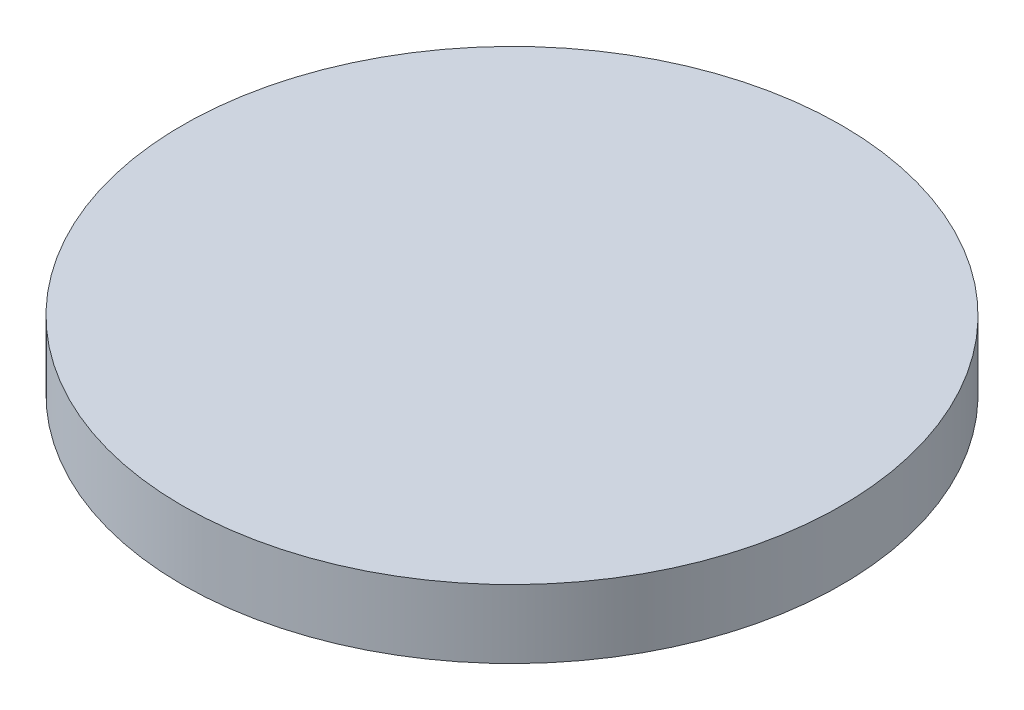
ISO-10303-21;
HEADER;
FILE_DESCRIPTION(('STEP AP214'),'2;1');
FILE_NAME('part.step','',(''),(''),'','','');
FILE_SCHEMA(('AUTOMOTIVE_DESIGN { 1 0 10303 214 1 1 1 1 }'));
ENDSEC;
DATA;
#1=APPLICATION_CONTEXT('core data for automotive mechanical design processes');
#2=APPLICATION_PROTOCOL_DEFINITION('international standard','automotive_design',2000,#1);
#3=PRODUCT_CONTEXT('',#1,'mechanical');
#4=PRODUCT('Part','Part','',(#3));
#5=PRODUCT_RELATED_PRODUCT_CATEGORY('part','',(#4));
#6=PRODUCT_DEFINITION_FORMATION('','',#4);
#7=PRODUCT_DEFINITION_CONTEXT('part definition',#1,'design');
#8=PRODUCT_DEFINITION('design','',#6,#7);
#9=PRODUCT_DEFINITION_SHAPE('','',#8);
#10=(LENGTH_UNIT() NAMED_UNIT(*) SI_UNIT(.MILLI.,.METRE.));
#11=(NAMED_UNIT(*) PLANE_ANGLE_UNIT() SI_UNIT($,.RADIAN.));
#12=(NAMED_UNIT(*) SI_UNIT($,.STERADIAN.) SOLID_ANGLE_UNIT());
#13=UNCERTAINTY_MEASURE_WITH_UNIT(LENGTH_MEASURE(1.E-05),#10,'distance_accuracy_value','');
#14=(GEOMETRIC_REPRESENTATION_CONTEXT(3) GLOBAL_UNCERTAINTY_ASSIGNED_CONTEXT((#13)) GLOBAL_UNIT_ASSIGNED_CONTEXT((#10,
#11,#12)) REPRESENTATION_CONTEXT('',''));
#15=CARTESIAN_POINT('',(0.,0.,0.));
#16=DIRECTION('',(0.,0.,1.));
#17=DIRECTION('',(1.,0.,0.));
#18=AXIS2_PLACEMENT_3D('',#15,#16,#17);
#19=CARTESIAN_POINT('',(0.,3.,0.));
#20=DIRECTION('',(0.,-1.,0.));
#21=DIRECTION('',(0.,0.,-1.));
#22=AXIS2_PLACEMENT_3D('',#19,#20,#21);
#23=CYLINDRICAL_SURFACE('',#22,14.45);
#24=CARTESIAN_POINT('',(0.,3.,0.));
#25=DIRECTION('',(0.,1.,0.));
#26=DIRECTION('',(0.,0.,1.));
#27=AXIS2_PLACEMENT_3D('',#24,#25,#26);
#28=CIRCLE('',#27,14.45);
#29=CARTESIAN_POINT('',(0.,3.,14.45));
#30=VERTEX_POINT('',#29);
#31=EDGE_CURVE('E10',#30,#30,#28,.T.);
#32=ORIENTED_EDGE('',*,*,#31,.F.);
#33=EDGE_LOOP('',(#32));
#34=FACE_BOUND('',#33,.T.);
#35=CARTESIAN_POINT('',(0.,0.,0.));
#36=DIRECTION('',(0.,1.,0.));
#37=DIRECTION('',(0.,0.,1.));
#38=AXIS2_PLACEMENT_3D('',#35,#36,#37);
#39=CIRCLE('',#38,14.45);
#40=CARTESIAN_POINT('',(0.,0.,14.45));
#41=VERTEX_POINT('',#40);
#42=EDGE_CURVE('E40',#41,#41,#39,.T.);
#43=ORIENTED_EDGE('',*,*,#42,.T.);
#44=EDGE_LOOP('',(#43));
#45=FACE_BOUND('',#44,.T.);
#46=ADVANCED_FACE('F37',(#34,#45),#23,.T.);
#47=CARTESIAN_POINT('',(0.,3.,0.));
#48=DIRECTION('',(0.,1.,0.));
#49=DIRECTION('',(0.,0.,1.));
#50=AXIS2_PLACEMENT_3D('',#47,#48,#49);
#51=PLANE('',#50);
#52=ORIENTED_EDGE('',*,*,#31,.T.);
#53=EDGE_LOOP('',(#52));
#54=FACE_BOUND('',#53,.T.);
#55=ADVANCED_FACE('F54',(#54),#51,.T.);
#56=CARTESIAN_POINT('',(0.,0.,0.));
#57=DIRECTION('',(0.,1.,0.));
#58=DIRECTION('',(0.,0.,1.));
#59=AXIS2_PLACEMENT_3D('',#56,#57,#58);
#60=PLANE('',#59);
#61=ORIENTED_EDGE('',*,*,#42,.F.);
#62=EDGE_LOOP('',(#61));
#63=FACE_BOUND('',#62,.T.);
#64=ADVANCED_FACE('F52',(#63),#60,.F.);
#65=CLOSED_SHELL('',(#46,#55,#64));
#66=MANIFOLD_SOLID_BREP('B2',#65);
#67=ADVANCED_BREP_SHAPE_REPRESENTATION('',(#18,#66),#14);
#68=SHAPE_DEFINITION_REPRESENTATION(#9,#67);
ENDSEC;
END-ISO-10303-21;
